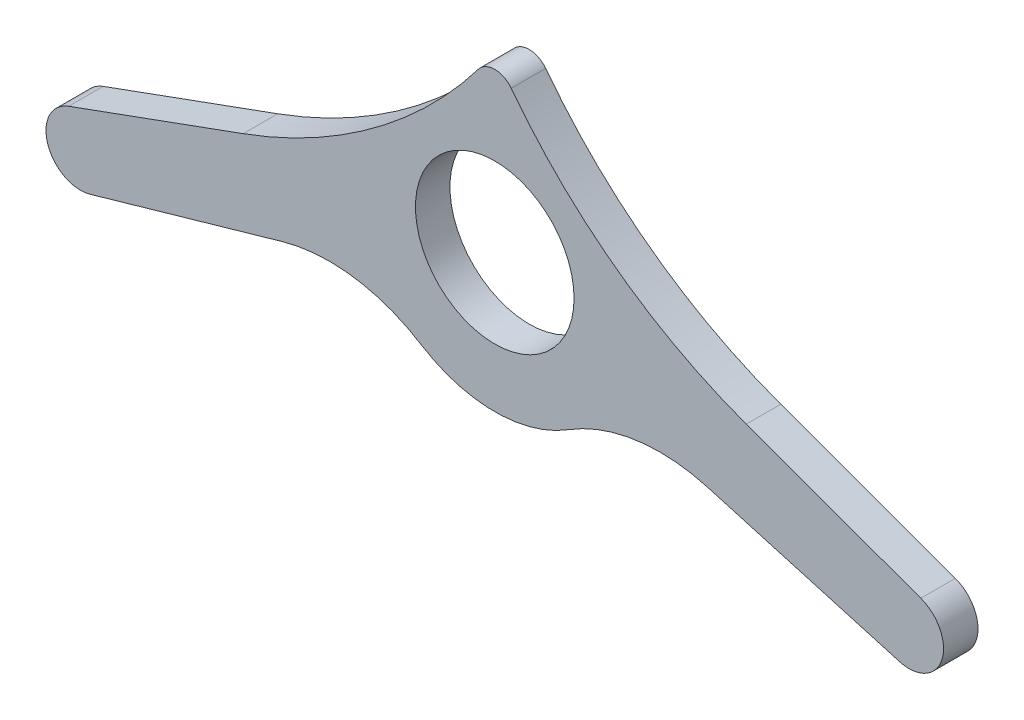
ISO-10303-21;
HEADER;
FILE_DESCRIPTION(('STEP AP214'),'2;1');
FILE_NAME('part.step','',(''),(''),'','','');
FILE_SCHEMA(('AUTOMOTIVE_DESIGN { 1 0 10303 214 1 1 1 1 }'));
ENDSEC;
DATA;
#1=APPLICATION_CONTEXT('core data for automotive mechanical design processes');
#2=APPLICATION_PROTOCOL_DEFINITION('international standard','automotive_design',2000,#1);
#3=PRODUCT_CONTEXT('',#1,'mechanical');
#4=PRODUCT('Part','Part','',(#3));
#5=PRODUCT_RELATED_PRODUCT_CATEGORY('part','',(#4));
#6=PRODUCT_DEFINITION_FORMATION('','',#4);
#7=PRODUCT_DEFINITION_CONTEXT('part definition',#1,'design');
#8=PRODUCT_DEFINITION('design','',#6,#7);
#9=PRODUCT_DEFINITION_SHAPE('','',#8);
#10=(LENGTH_UNIT() NAMED_UNIT(*) SI_UNIT(.MILLI.,.METRE.));
#11=(NAMED_UNIT(*) PLANE_ANGLE_UNIT() SI_UNIT($,.RADIAN.));
#12=(NAMED_UNIT(*) SI_UNIT($,.STERADIAN.) SOLID_ANGLE_UNIT());
#13=UNCERTAINTY_MEASURE_WITH_UNIT(LENGTH_MEASURE(1.E-05),#10,'distance_accuracy_value','');
#14=(GEOMETRIC_REPRESENTATION_CONTEXT(3) GLOBAL_UNCERTAINTY_ASSIGNED_CONTEXT((#13)) GLOBAL_UNIT_ASSIGNED_CONTEXT((#10,
#11,#12)) REPRESENTATION_CONTEXT('',''));
#15=CARTESIAN_POINT('',(0.,0.,0.));
#16=DIRECTION('',(0.,0.,1.));
#17=DIRECTION('',(1.,0.,0.));
#18=AXIS2_PLACEMENT_3D('',#15,#16,#17);
#19=CARTESIAN_POINT('',(-60.0788559961449,-17.2273347385625,5.));
#20=DIRECTION('',(0.,0.,-1.));
#21=DIRECTION('',(-1.,0.,0.));
#22=AXIS2_PLACEMENT_3D('',#19,#20,#21);
#23=CYLINDRICAL_SURFACE('',#22,4.99999999999988);
#24=CARTESIAN_POINT('',(-60.0788559961449,-17.2273347385625,0.));
#25=DIRECTION('',(0.,0.,1.));
#26=DIRECTION('',(1.,0.,0.));
#27=AXIS2_PLACEMENT_3D('',#24,#25,#26);
#28=CIRCLE('',#27,4.99999999999988);
#29=CARTESIAN_POINT('',(-58.7006692170599,-22.0336432182541,0.));
#30=VERTEX_POINT('',#29);
#31=CARTESIAN_POINT('',(-61.7889567127732,-12.5288716346329,0.));
#32=VERTEX_POINT('',#31);
#33=EDGE_CURVE('E161',#30,#32,#28,.F.);
#34=ORIENTED_EDGE('',*,*,#33,.F.);
#35=DIRECTION('',(0.,0.,-1.));
#36=VECTOR('',#35,1.);
#37=CARTESIAN_POINT('',(-58.7006692170599,-22.0336432182541,5.));
#38=LINE('',#37,#36);
#39=CARTESIAN_POINT('',(-58.7006692170599,-22.0336432182541,5.));
#40=VERTEX_POINT('',#39);
#41=EDGE_CURVE('E11',#40,#30,#38,.T.);
#42=ORIENTED_EDGE('',*,*,#41,.F.);
#43=CARTESIAN_POINT('',(-60.0788559961449,-17.2273347385625,5.));
#44=DIRECTION('',(0.,0.,1.));
#45=DIRECTION('',(1.,0.,0.));
#46=AXIS2_PLACEMENT_3D('',#43,#44,#45);
#47=CIRCLE('',#46,4.99999999999988);
#48=CARTESIAN_POINT('',(-61.7889567127732,-12.5288716346329,5.));
#49=VERTEX_POINT('',#48);
#50=EDGE_CURVE('E192',#40,#49,#47,.F.);
#51=ORIENTED_EDGE('',*,*,#50,.T.);
#52=DIRECTION('',(0.,0.,-1.));
#53=VECTOR('',#52,1.);
#54=CARTESIAN_POINT('',(-61.7889567127732,-12.5288716346329,5.));
#55=LINE('',#54,#53);
#56=EDGE_CURVE('E54',#49,#32,#55,.T.);
#57=ORIENTED_EDGE('',*,*,#56,.T.);
#58=EDGE_LOOP('',(#34,#42,#51,#57));
#59=FACE_BOUND('',#58,.T.);
#60=ADVANCED_FACE('F39',(#59),#23,.T.);
#61=CARTESIAN_POINT('',(1.378186779085,-4.80630847969157,5.));
#62=DIRECTION('',(-0.275637355817,0.961261695938319,0.));
#63=DIRECTION('',(-0.961261695938319,-0.275637355817,0.));
#64=AXIS2_PLACEMENT_3D('',#61,#62,#63);
#65=PLANE('',#64);
#66=DIRECTION('',(0.961261695938319,0.275637355817,0.));
#67=VECTOR('',#66,1.);
#68=CARTESIAN_POINT('',(1.378186779085,-4.80630847969157,0.));
#69=LINE('',#68,#67);
#70=CARTESIAN_POINT('',(-30.8635106651872,-14.0514664508682,0.));
#71=VERTEX_POINT('',#70);
#72=EDGE_CURVE('E164',#30,#71,#69,.T.);
#73=ORIENTED_EDGE('',*,*,#72,.T.);
#74=DIRECTION('',(0.,0.,-1.));
#75=VECTOR('',#74,1.);
#76=CARTESIAN_POINT('',(-30.8635106651872,-14.0514664508682,5.));
#77=LINE('',#76,#75);
#78=CARTESIAN_POINT('',(-30.8635106651872,-14.0514664508682,5.));
#79=VERTEX_POINT('',#78);
#80=EDGE_CURVE('E50',#79,#71,#77,.T.);
#81=ORIENTED_EDGE('',*,*,#80,.F.);
#82=DIRECTION('',(0.961261695938319,0.275637355817,0.));
#83=VECTOR('',#82,1.);
#84=CARTESIAN_POINT('',(1.378186779085,-4.80630847969157,5.));
#85=LINE('',#84,#83);
#86=EDGE_CURVE('E234',#40,#79,#85,.T.);
#87=ORIENTED_EDGE('',*,*,#86,.F.);
#88=ORIENTED_EDGE('',*,*,#41,.T.);
#89=EDGE_LOOP('',(#73,#81,#87,#88));
#90=FACE_BOUND('',#89,.T.);
#91=ADVANCED_FACE('F270',(#90),#65,.F.);
#92=CARTESIAN_POINT('',(-23.9725767697622,-38.0830088493262,5.));
#93=DIRECTION('',(0.,0.,-1.));
#94=DIRECTION('',(-1.,0.,0.));
#95=AXIS2_PLACEMENT_3D('',#92,#93,#94);
#96=CYLINDRICAL_SURFACE('',#95,25.);
#97=CARTESIAN_POINT('',(-23.9725767697622,-38.0830088493262,0.));
#98=DIRECTION('',(0.,0.,1.));
#99=DIRECTION('',(1.,0.,0.));
#100=AXIS2_PLACEMENT_3D('',#97,#98,#99);
#101=CIRCLE('',#100,25.);
#102=CARTESIAN_POINT('',(-10.6544785643388,-16.9257817108116,0.));
#103=VERTEX_POINT('',#102);
#104=EDGE_CURVE('E165',#71,#103,#101,.F.);
#105=ORIENTED_EDGE('',*,*,#104,.T.);
#106=DIRECTION('',(0.,0.,-1.));
#107=VECTOR('',#106,1.);
#108=CARTESIAN_POINT('',(-10.6544785643388,-16.9257817108116,5.));
#109=LINE('',#108,#107);
#110=CARTESIAN_POINT('',(-10.6544785643388,-16.9257817108116,5.));
#111=VERTEX_POINT('',#110);
#112=EDGE_CURVE('E207',#111,#103,#109,.T.);
#113=ORIENTED_EDGE('',*,*,#112,.F.);
#114=CARTESIAN_POINT('',(-23.9725767697622,-38.0830088493262,5.));
#115=DIRECTION('',(0.,0.,1.));
#116=DIRECTION('',(1.,0.,0.));
#117=AXIS2_PLACEMENT_3D('',#114,#115,#116);
#118=CIRCLE('',#117,25.);
#119=EDGE_CURVE('E218',#79,#111,#118,.F.);
#120=ORIENTED_EDGE('',*,*,#119,.F.);
#121=ORIENTED_EDGE('',*,*,#80,.T.);
#122=EDGE_LOOP('',(#105,#113,#120,#121));
#123=FACE_BOUND('',#122,.T.);
#124=ADVANCED_FACE('F215',(#123),#96,.F.);
#125=CARTESIAN_POINT('',(0.,0.,5.));
#126=DIRECTION('',(0.,0.,-1.));
#127=DIRECTION('',(-1.,0.,0.));
#128=AXIS2_PLACEMENT_3D('',#125,#126,#127);
#129=CYLINDRICAL_SURFACE('',#128,20.);
#130=CARTESIAN_POINT('',(0.,0.,0.));
#131=DIRECTION('',(0.,0.,1.));
#132=DIRECTION('',(1.,0.,0.));
#133=AXIS2_PLACEMENT_3D('',#130,#131,#132);
#134=CIRCLE('',#133,20.);
#135=CARTESIAN_POINT('',(10.6544785643388,-16.9257817108116,0.));
#136=VERTEX_POINT('',#135);
#137=EDGE_CURVE('E167',#103,#136,#134,.T.);
#138=ORIENTED_EDGE('',*,*,#137,.T.);
#139=DIRECTION('',(0.,0.,-1.));
#140=VECTOR('',#139,1.);
#141=CARTESIAN_POINT('',(10.6544785643388,-16.9257817108116,5.));
#142=LINE('',#141,#140);
#143=CARTESIAN_POINT('',(10.6544785643388,-16.9257817108116,5.));
#144=VERTEX_POINT('',#143);
#145=EDGE_CURVE('E203',#144,#136,#142,.T.);
#146=ORIENTED_EDGE('',*,*,#145,.F.);
#147=CARTESIAN_POINT('',(0.,0.,5.));
#148=DIRECTION('',(0.,0.,1.));
#149=DIRECTION('',(1.,0.,0.));
#150=AXIS2_PLACEMENT_3D('',#147,#148,#149);
#151=CIRCLE('',#150,20.);
#152=EDGE_CURVE('E227',#111,#144,#151,.T.);
#153=ORIENTED_EDGE('',*,*,#152,.F.);
#154=ORIENTED_EDGE('',*,*,#112,.T.);
#155=EDGE_LOOP('',(#138,#146,#153,#154));
#156=FACE_BOUND('',#155,.T.);
#157=ADVANCED_FACE('F226',(#156),#129,.T.);
#158=CARTESIAN_POINT('',(23.9725767697622,-38.0830088493262,5.));
#159=DIRECTION('',(0.,0.,-1.));
#160=DIRECTION('',(-1.,0.,0.));
#161=AXIS2_PLACEMENT_3D('',#158,#159,#160);
#162=CYLINDRICAL_SURFACE('',#161,25.);
#163=CARTESIAN_POINT('',(23.9725767697622,-38.0830088493262,0.));
#164=DIRECTION('',(0.,0.,1.));
#165=DIRECTION('',(1.,0.,0.));
#166=AXIS2_PLACEMENT_3D('',#163,#164,#165);
#167=CIRCLE('',#166,25.);
#168=CARTESIAN_POINT('',(30.8635106651872,-14.0514664508682,0.));
#169=VERTEX_POINT('',#168);
#170=EDGE_CURVE('E169',#169,#136,#167,.T.);
#171=ORIENTED_EDGE('',*,*,#170,.F.);
#172=DIRECTION('',(0.,0.,-1.));
#173=VECTOR('',#172,1.);
#174=CARTESIAN_POINT('',(30.8635106651872,-14.0514664508682,5.));
#175=LINE('',#174,#173);
#176=CARTESIAN_POINT('',(30.8635106651872,-14.0514664508682,5.));
#177=VERTEX_POINT('',#176);
#178=EDGE_CURVE('E201',#177,#169,#175,.T.);
#179=ORIENTED_EDGE('',*,*,#178,.F.);
#180=CARTESIAN_POINT('',(23.9725767697622,-38.0830088493262,5.));
#181=DIRECTION('',(0.,0.,1.));
#182=DIRECTION('',(1.,0.,0.));
#183=AXIS2_PLACEMENT_3D('',#180,#181,#182);
#184=CIRCLE('',#183,25.);
#185=EDGE_CURVE('E231',#177,#144,#184,.T.);
#186=ORIENTED_EDGE('',*,*,#185,.T.);
#187=ORIENTED_EDGE('',*,*,#145,.T.);
#188=EDGE_LOOP('',(#171,#179,#186,#187));
#189=FACE_BOUND('',#188,.T.);
#190=ADVANCED_FACE('F277',(#189),#162,.F.);
#191=CARTESIAN_POINT('',(-1.378186779085,-4.80630847969157,5.));
#192=DIRECTION('',(-0.275637355817,-0.961261695938319,0.));
#193=DIRECTION('',(0.961261695938319,-0.275637355817,0.));
#194=AXIS2_PLACEMENT_3D('',#191,#192,#193);
#195=PLANE('',#194);
#196=DIRECTION('',(-0.961261695938319,0.275637355817,0.));
#197=VECTOR('',#196,1.);
#198=CARTESIAN_POINT('',(-1.378186779085,-4.80630847969157,0.));
#199=LINE('',#198,#197);
#200=CARTESIAN_POINT('',(58.7006692170599,-22.0336432182541,0.));
#201=VERTEX_POINT('',#200);
#202=EDGE_CURVE('E171',#201,#169,#199,.T.);
#203=ORIENTED_EDGE('',*,*,#202,.F.);
#204=DIRECTION('',(0.,0.,-1.));
#205=VECTOR('',#204,1.);
#206=CARTESIAN_POINT('',(58.7006692170599,-22.0336432182541,5.));
#207=LINE('',#206,#205);
#208=CARTESIAN_POINT('',(58.7006692170599,-22.0336432182541,5.));
#209=VERTEX_POINT('',#208);
#210=EDGE_CURVE('E202',#209,#201,#207,.T.);
#211=ORIENTED_EDGE('',*,*,#210,.F.);
#212=DIRECTION('',(-0.961261695938319,0.275637355817,0.));
#213=VECTOR('',#212,1.);
#214=CARTESIAN_POINT('',(-1.378186779085,-4.80630847969157,5.));
#215=LINE('',#214,#213);
#216=EDGE_CURVE('E232',#209,#177,#215,.T.);
#217=ORIENTED_EDGE('',*,*,#216,.T.);
#218=ORIENTED_EDGE('',*,*,#178,.T.);
#219=EDGE_LOOP('',(#203,#211,#217,#218));
#220=FACE_BOUND('',#219,.T.);
#221=ADVANCED_FACE('F282',(#220),#195,.T.);
#222=CARTESIAN_POINT('',(60.0788559961449,-17.2273347385625,5.));
#223=DIRECTION('',(0.,0.,-1.));
#224=DIRECTION('',(-1.,0.,0.));
#225=AXIS2_PLACEMENT_3D('',#222,#223,#224);
#226=CYLINDRICAL_SURFACE('',#225,4.99999999999992);
#227=CARTESIAN_POINT('',(60.0788559961449,-17.2273347385625,0.));
#228=DIRECTION('',(0.,0.,1.));
#229=DIRECTION('',(1.,0.,0.));
#230=AXIS2_PLACEMENT_3D('',#227,#228,#229);
#231=CIRCLE('',#230,4.99999999999992);
#232=CARTESIAN_POINT('',(61.7889567127732,-12.5288716346329,0.));
#233=VERTEX_POINT('',#232);
#234=EDGE_CURVE('E176',#201,#233,#231,.T.);
#235=ORIENTED_EDGE('',*,*,#234,.T.);
#236=DIRECTION('',(0.,0.,-1.));
#237=VECTOR('',#236,1.);
#238=CARTESIAN_POINT('',(61.7889567127732,-12.5288716346329,5.));
#239=LINE('',#238,#237);
#240=CARTESIAN_POINT('',(61.7889567127732,-12.5288716346329,5.));
#241=VERTEX_POINT('',#240);
#242=EDGE_CURVE('E199',#241,#233,#239,.T.);
#243=ORIENTED_EDGE('',*,*,#242,.F.);
#244=CARTESIAN_POINT('',(60.0788559961449,-17.2273347385625,5.));
#245=DIRECTION('',(0.,0.,1.));
#246=DIRECTION('',(1.,0.,0.));
#247=AXIS2_PLACEMENT_3D('',#244,#245,#246);
#248=CIRCLE('',#247,4.99999999999992);
#249=EDGE_CURVE('E241',#209,#241,#248,.T.);
#250=ORIENTED_EDGE('',*,*,#249,.F.);
#251=ORIENTED_EDGE('',*,*,#210,.T.);
#252=EDGE_LOOP('',(#235,#243,#250,#251));
#253=FACE_BOUND('',#252,.T.);
#254=ADVANCED_FACE('F283',(#253),#226,.T.);
#255=CARTESIAN_POINT('',(3.20123316336933,8.7953158307667,5.));
#256=DIRECTION('',(-0.342020143325663,-0.93969262078591,0.));
#257=DIRECTION('',(0.93969262078591,-0.342020143325663,0.));
#258=AXIS2_PLACEMENT_3D('',#255,#256,#257);
#259=PLANE('',#258);
#260=DIRECTION('',(-0.939692620785911,0.342020143325663,0.));
#261=VECTOR('',#260,1.);
#262=CARTESIAN_POINT('',(3.20123316336933,8.7953158307667,0.));
#263=LINE('',#262,#261);
#264=CARTESIAN_POINT('',(36.475889527471,-3.31566864120254,0.));
#265=VERTEX_POINT('',#264);
#266=EDGE_CURVE('E178',#233,#265,#263,.T.);
#267=ORIENTED_EDGE('',*,*,#266,.T.);
#268=DIRECTION('',(0.,0.,-1.));
#269=VECTOR('',#268,1.);
#270=CARTESIAN_POINT('',(36.475889527471,-3.31566864120254,5.));
#271=LINE('',#270,#269);
#272=CARTESIAN_POINT('',(36.475889527471,-3.31566864120254,5.));
#273=VERTEX_POINT('',#272);
#274=EDGE_CURVE('E193',#273,#265,#271,.T.);
#275=ORIENTED_EDGE('',*,*,#274,.F.);
#276=DIRECTION('',(-0.939692620785911,0.342020143325663,0.));
#277=VECTOR('',#276,1.);
#278=CARTESIAN_POINT('',(3.20123316336933,8.7953158307667,5.));
#279=LINE('',#278,#277);
#280=EDGE_CURVE('E244',#241,#273,#279,.T.);
#281=ORIENTED_EDGE('',*,*,#280,.F.);
#282=ORIENTED_EDGE('',*,*,#242,.T.);
#283=EDGE_LOOP('',(#267,#275,#281,#282));
#284=FACE_BOUND('',#283,.T.);
#285=ADVANCED_FACE('F248',(#284),#259,.F.);
#286=CARTESIAN_POINT('',(62.1274002768957,67.1612779177407,5.));
#287=DIRECTION('',(0.,0.,-1.));
#288=DIRECTION('',(-1.,0.,0.));
#289=AXIS2_PLACEMENT_3D('',#286,#287,#288);
#290=CYLINDRICAL_SURFACE('',#289,75.);
#291=CARTESIAN_POINT('',(62.1274002768957,67.1612779177407,0.));
#292=DIRECTION('',(0.,0.,1.));
#293=DIRECTION('',(1.,0.,0.));
#294=AXIS2_PLACEMENT_3D('',#291,#292,#293);
#295=CIRCLE('',#294,75.);
#296=CARTESIAN_POINT('',(2.38951539526521,21.8138953045285,0.));
#297=VERTEX_POINT('',#296);
#298=EDGE_CURVE('E179',#265,#297,#295,.F.);
#299=ORIENTED_EDGE('',*,*,#298,.T.);
#300=DIRECTION('',(0.,0.,-1.));
#301=VECTOR('',#300,1.);
#302=CARTESIAN_POINT('',(2.38951539526521,21.8138953045285,5.));
#303=LINE('',#302,#301);
#304=CARTESIAN_POINT('',(2.38951539526521,21.8138953045285,5.));
#305=VERTEX_POINT('',#304);
#306=EDGE_CURVE('E148',#305,#297,#303,.T.);
#307=ORIENTED_EDGE('',*,*,#306,.F.);
#308=CARTESIAN_POINT('',(62.1274002768957,67.1612779177407,5.));
#309=DIRECTION('',(0.,0.,1.));
#310=DIRECTION('',(1.,0.,0.));
#311=AXIS2_PLACEMENT_3D('',#308,#309,#310);
#312=CIRCLE('',#311,75.);
#313=EDGE_CURVE('E138',#273,#305,#312,.F.);
#314=ORIENTED_EDGE('',*,*,#313,.F.);
#315=ORIENTED_EDGE('',*,*,#274,.T.);
#316=EDGE_LOOP('',(#299,#307,#314,#315));
#317=FACE_BOUND('',#316,.T.);
#318=ADVANCED_FACE('F253',(#317),#290,.F.);
#319=CARTESIAN_POINT('',(0.,20.,5.));
#320=DIRECTION('',(0.,0.,-1.));
#321=DIRECTION('',(-1.,0.,0.));
#322=AXIS2_PLACEMENT_3D('',#319,#320,#321);
#323=CYLINDRICAL_SURFACE('',#322,2.99999999999999);
#324=CARTESIAN_POINT('',(0.,20.,0.));
#325=DIRECTION('',(0.,0.,1.));
#326=DIRECTION('',(1.,0.,0.));
#327=AXIS2_PLACEMENT_3D('',#324,#325,#326);
#328=CIRCLE('',#327,2.99999999999999);
#329=CARTESIAN_POINT('',(-2.38951539526521,21.8138953045285,0.));
#330=VERTEX_POINT('',#329);
#331=EDGE_CURVE('E150',#297,#330,#328,.T.);
#332=ORIENTED_EDGE('',*,*,#331,.T.);
#333=DIRECTION('',(0.,0.,-1.));
#334=VECTOR('',#333,1.);
#335=CARTESIAN_POINT('',(-2.38951539526521,21.8138953045285,5.));
#336=LINE('',#335,#334);
#337=CARTESIAN_POINT('',(-2.38951539526521,21.8138953045285,5.));
#338=VERTEX_POINT('',#337);
#339=EDGE_CURVE('E143',#338,#330,#336,.T.);
#340=ORIENTED_EDGE('',*,*,#339,.F.);
#341=CARTESIAN_POINT('',(0.,20.,5.));
#342=DIRECTION('',(0.,0.,1.));
#343=DIRECTION('',(1.,0.,0.));
#344=AXIS2_PLACEMENT_3D('',#341,#342,#343);
#345=CIRCLE('',#344,2.99999999999999);
#346=EDGE_CURVE('E129',#305,#338,#345,.T.);
#347=ORIENTED_EDGE('',*,*,#346,.F.);
#348=ORIENTED_EDGE('',*,*,#306,.T.);
#349=EDGE_LOOP('',(#332,#340,#347,#348));
#350=FACE_BOUND('',#349,.T.);
#351=ADVANCED_FACE('F144',(#350),#323,.T.);
#352=CARTESIAN_POINT('',(-62.1274002768957,67.1612779177407,5.));
#353=DIRECTION('',(0.,0.,-1.));
#354=DIRECTION('',(-1.,0.,0.));
#355=AXIS2_PLACEMENT_3D('',#352,#353,#354);
#356=CYLINDRICAL_SURFACE('',#355,75.);
#357=CARTESIAN_POINT('',(-62.1274002768957,67.1612779177407,0.));
#358=DIRECTION('',(0.,0.,1.));
#359=DIRECTION('',(1.,0.,0.));
#360=AXIS2_PLACEMENT_3D('',#357,#358,#359);
#361=CIRCLE('',#360,75.);
#362=CARTESIAN_POINT('',(-36.475889527471,-3.31566864120254,0.));
#363=VERTEX_POINT('',#362);
#364=EDGE_CURVE('E183',#363,#330,#361,.T.);
#365=ORIENTED_EDGE('',*,*,#364,.F.);
#366=DIRECTION('',(0.,0.,-1.));
#367=VECTOR('',#366,1.);
#368=CARTESIAN_POINT('',(-36.475889527471,-3.31566864120254,5.));
#369=LINE('',#368,#367);
#370=CARTESIAN_POINT('',(-36.475889527471,-3.31566864120254,5.));
#371=VERTEX_POINT('',#370);
#372=EDGE_CURVE('E95',#371,#363,#369,.T.);
#373=ORIENTED_EDGE('',*,*,#372,.F.);
#374=CARTESIAN_POINT('',(-62.1274002768957,67.1612779177407,5.));
#375=DIRECTION('',(0.,0.,1.));
#376=DIRECTION('',(1.,0.,0.));
#377=AXIS2_PLACEMENT_3D('',#374,#375,#376);
#378=CIRCLE('',#377,75.);
#379=EDGE_CURVE('E136',#371,#338,#378,.T.);
#380=ORIENTED_EDGE('',*,*,#379,.T.);
#381=ORIENTED_EDGE('',*,*,#339,.T.);
#382=EDGE_LOOP('',(#365,#373,#380,#381));
#383=FACE_BOUND('',#382,.T.);
#384=ADVANCED_FACE('F152',(#383),#356,.F.);
#385=CARTESIAN_POINT('',(-3.20123316336933,8.7953158307667,5.));
#386=DIRECTION('',(-0.342020143325663,0.93969262078591,0.));
#387=DIRECTION('',(-0.93969262078591,-0.342020143325663,0.));
#388=AXIS2_PLACEMENT_3D('',#385,#386,#387);
#389=PLANE('',#388);
#390=DIRECTION('',(0.939692620785911,0.342020143325663,0.));
#391=VECTOR('',#390,1.);
#392=CARTESIAN_POINT('',(-3.20123316336933,8.7953158307667,0.));
#393=LINE('',#392,#391);
#394=EDGE_CURVE('E184',#32,#363,#393,.T.);
#395=ORIENTED_EDGE('',*,*,#394,.F.);
#396=ORIENTED_EDGE('',*,*,#56,.F.);
#397=DIRECTION('',(0.939692620785911,0.342020143325663,0.));
#398=VECTOR('',#397,1.);
#399=CARTESIAN_POINT('',(-3.20123316336933,8.7953158307667,5.));
#400=LINE('',#399,#398);
#401=EDGE_CURVE('E154',#49,#371,#400,.T.);
#402=ORIENTED_EDGE('',*,*,#401,.T.);
#403=ORIENTED_EDGE('',*,*,#372,.T.);
#404=EDGE_LOOP('',(#395,#396,#402,#403));
#405=FACE_BOUND('',#404,.T.);
#406=ADVANCED_FACE('F255',(#405),#389,.T.);
#407=CARTESIAN_POINT('',(0.,0.,5.));
#408=DIRECTION('',(0.,0.,-1.));
#409=DIRECTION('',(-1.,0.,0.));
#410=AXIS2_PLACEMENT_3D('',#407,#408,#409);
#411=CYLINDRICAL_SURFACE('',#410,11.5);
#412=CARTESIAN_POINT('',(0.,0.,5.));
#413=DIRECTION('',(0.,0.,1.));
#414=DIRECTION('',(1.,0.,0.));
#415=AXIS2_PLACEMENT_3D('',#412,#413,#414);
#416=CIRCLE('',#415,11.5);
#417=CARTESIAN_POINT('',(11.5,0.,5.));
#418=VERTEX_POINT('',#417);
#419=EDGE_CURVE('E155',#418,#418,#416,.T.);
#420=ORIENTED_EDGE('',*,*,#419,.T.);
#421=EDGE_LOOP('',(#420));
#422=FACE_BOUND('',#421,.T.);
#423=CARTESIAN_POINT('',(0.,0.,0.));
#424=DIRECTION('',(0.,0.,1.));
#425=DIRECTION('',(1.,0.,0.));
#426=AXIS2_PLACEMENT_3D('',#423,#424,#425);
#427=CIRCLE('',#426,11.5);
#428=CARTESIAN_POINT('',(11.5,0.,0.));
#429=VERTEX_POINT('',#428);
#430=EDGE_CURVE('E187',#429,#429,#427,.T.);
#431=ORIENTED_EDGE('',*,*,#430,.F.);
#432=EDGE_LOOP('',(#431));
#433=FACE_BOUND('',#432,.T.);
#434=ADVANCED_FACE('F257',(#422,#433),#411,.F.);
#435=CARTESIAN_POINT('',(0.,0.,5.));
#436=DIRECTION('',(0.,0.,1.));
#437=DIRECTION('',(1.,0.,0.));
#438=AXIS2_PLACEMENT_3D('',#435,#436,#437);
#439=PLANE('',#438);
#440=ORIENTED_EDGE('',*,*,#50,.F.);
#441=ORIENTED_EDGE('',*,*,#86,.T.);
#442=ORIENTED_EDGE('',*,*,#119,.T.);
#443=ORIENTED_EDGE('',*,*,#152,.T.);
#444=ORIENTED_EDGE('',*,*,#185,.F.);
#445=ORIENTED_EDGE('',*,*,#216,.F.);
#446=ORIENTED_EDGE('',*,*,#249,.T.);
#447=ORIENTED_EDGE('',*,*,#280,.T.);
#448=ORIENTED_EDGE('',*,*,#313,.T.);
#449=ORIENTED_EDGE('',*,*,#346,.T.);
#450=ORIENTED_EDGE('',*,*,#379,.F.);
#451=ORIENTED_EDGE('',*,*,#401,.F.);
#452=EDGE_LOOP('',(#440,#441,#442,#443,#444,#445,#446,#447,#448,#449,#450,#451));
#453=FACE_BOUND('',#452,.T.);
#454=ORIENTED_EDGE('',*,*,#419,.F.);
#455=EDGE_LOOP('',(#454));
#456=FACE_BOUND('',#455,.T.);
#457=ADVANCED_FACE('F135',(#453,#456),#439,.T.);
#458=CARTESIAN_POINT('',(0.,0.,0.));
#459=DIRECTION('',(0.,0.,1.));
#460=DIRECTION('',(1.,0.,0.));
#461=AXIS2_PLACEMENT_3D('',#458,#459,#460);
#462=PLANE('',#461);
#463=ORIENTED_EDGE('',*,*,#33,.T.);
#464=ORIENTED_EDGE('',*,*,#394,.T.);
#465=ORIENTED_EDGE('',*,*,#364,.T.);
#466=ORIENTED_EDGE('',*,*,#331,.F.);
#467=ORIENTED_EDGE('',*,*,#298,.F.);
#468=ORIENTED_EDGE('',*,*,#266,.F.);
#469=ORIENTED_EDGE('',*,*,#234,.F.);
#470=ORIENTED_EDGE('',*,*,#202,.T.);
#471=ORIENTED_EDGE('',*,*,#170,.T.);
#472=ORIENTED_EDGE('',*,*,#137,.F.);
#473=ORIENTED_EDGE('',*,*,#104,.F.);
#474=ORIENTED_EDGE('',*,*,#72,.F.);
#475=EDGE_LOOP('',(#463,#464,#465,#466,#467,#468,#469,#470,#471,#472,#473,#474));
#476=FACE_BOUND('',#475,.T.);
#477=ORIENTED_EDGE('',*,*,#430,.T.);
#478=EDGE_LOOP('',(#477));
#479=FACE_BOUND('',#478,.T.);
#480=ADVANCED_FACE('F221',(#476,#479),#462,.F.);
#481=CLOSED_SHELL('',(#60,#91,#124,#157,#190,#221,#254,#285,#318,#351,#384,#406,#434,#457,#480));
#482=MANIFOLD_SOLID_BREP('B2',#481);
#483=ADVANCED_BREP_SHAPE_REPRESENTATION('',(#18,#482),#14);
#484=SHAPE_DEFINITION_REPRESENTATION(#9,#483);
ENDSEC;
END-ISO-10303-21;
